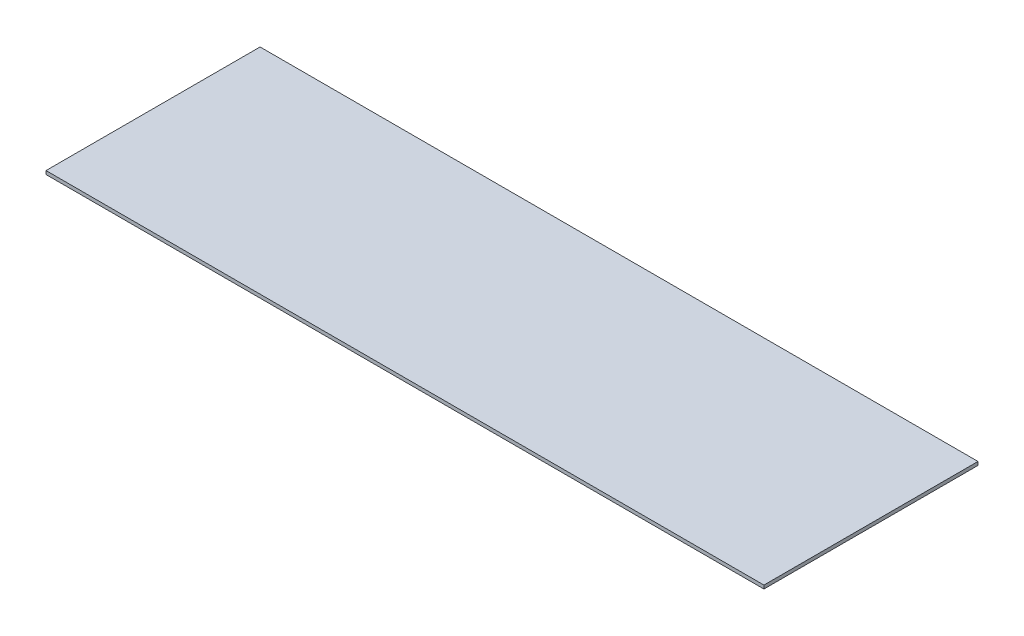
ISO-10303-21;
HEADER;
FILE_DESCRIPTION(('STEP AP214'),'2;1');
FILE_NAME('part.step','',(''),(''),'','','');
FILE_SCHEMA(('AUTOMOTIVE_DESIGN { 1 0 10303 214 1 1 1 1 }'));
ENDSEC;
DATA;
#1=APPLICATION_CONTEXT('core data for automotive mechanical design processes');
#2=APPLICATION_PROTOCOL_DEFINITION('international standard','automotive_design',2000,#1);
#3=PRODUCT_CONTEXT('',#1,'mechanical');
#4=PRODUCT('Part','Part','',(#3));
#5=PRODUCT_RELATED_PRODUCT_CATEGORY('part','',(#4));
#6=PRODUCT_DEFINITION_FORMATION('','',#4);
#7=PRODUCT_DEFINITION_CONTEXT('part definition',#1,'design');
#8=PRODUCT_DEFINITION('design','',#6,#7);
#9=PRODUCT_DEFINITION_SHAPE('','',#8);
#10=(LENGTH_UNIT() NAMED_UNIT(*) SI_UNIT(.MILLI.,.METRE.));
#11=(NAMED_UNIT(*) PLANE_ANGLE_UNIT() SI_UNIT($,.RADIAN.));
#12=(NAMED_UNIT(*) SI_UNIT($,.STERADIAN.) SOLID_ANGLE_UNIT());
#13=UNCERTAINTY_MEASURE_WITH_UNIT(LENGTH_MEASURE(1.E-05),#10,'distance_accuracy_value','');
#14=(GEOMETRIC_REPRESENTATION_CONTEXT(3) GLOBAL_UNCERTAINTY_ASSIGNED_CONTEXT((#13)) GLOBAL_UNIT_ASSIGNED_CONTEXT((#10,
#11,#12)) REPRESENTATION_CONTEXT('',''));
#15=CARTESIAN_POINT('',(0.,0.,0.));
#16=DIRECTION('',(0.,0.,1.));
#17=DIRECTION('',(1.,0.,0.));
#18=AXIS2_PLACEMENT_3D('',#15,#16,#17);
#19=CARTESIAN_POINT('',(-657.606,3.175,0.));
#20=DIRECTION('',(-1.,0.,0.));
#21=DIRECTION('',(0.,0.,1.));
#22=AXIS2_PLACEMENT_3D('',#19,#20,#21);
#23=PLANE('',#22);
#24=DIRECTION('',(0.,0.,-1.));
#25=VECTOR('',#24,1.);
#26=CARTESIAN_POINT('',(-657.606,0.,0.));
#27=LINE('',#26,#25);
#28=CARTESIAN_POINT('',(-657.606,0.,0.));
#29=VERTEX_POINT('',#28);
#30=CARTESIAN_POINT('',(-657.606,0.,-196.088));
#31=VERTEX_POINT('',#30);
#32=EDGE_CURVE('E110',#29,#31,#27,.T.);
#33=ORIENTED_EDGE('',*,*,#32,.F.);
#34=DIRECTION('',(0.,-1.,0.));
#35=VECTOR('',#34,1.);
#36=CARTESIAN_POINT('',(-657.606,3.175,0.));
#37=LINE('',#36,#35);
#38=CARTESIAN_POINT('',(-657.606,3.175,0.));
#39=VERTEX_POINT('',#38);
#40=EDGE_CURVE('E11',#39,#29,#37,.T.);
#41=ORIENTED_EDGE('',*,*,#40,.F.);
#42=DIRECTION('',(0.,0.,-1.));
#43=VECTOR('',#42,1.);
#44=CARTESIAN_POINT('',(-657.606,3.175,0.));
#45=LINE('',#44,#43);
#46=CARTESIAN_POINT('',(-657.606,3.175,-196.088));
#47=VERTEX_POINT('',#46);
#48=EDGE_CURVE('E101',#39,#47,#45,.T.);
#49=ORIENTED_EDGE('',*,*,#48,.T.);
#50=DIRECTION('',(0.,-1.,0.));
#51=VECTOR('',#50,1.);
#52=CARTESIAN_POINT('',(-657.606,3.175,-196.088));
#53=LINE('',#52,#51);
#54=EDGE_CURVE('E80',#47,#31,#53,.T.);
#55=ORIENTED_EDGE('',*,*,#54,.T.);
#56=EDGE_LOOP('',(#33,#41,#49,#55));
#57=FACE_BOUND('',#56,.T.);
#58=ADVANCED_FACE('F41',(#57),#23,.T.);
#59=CARTESIAN_POINT('',(0.,3.175,0.));
#60=DIRECTION('',(0.,0.,1.));
#61=DIRECTION('',(1.,0.,0.));
#62=AXIS2_PLACEMENT_3D('',#59,#60,#61);
#63=PLANE('',#62);
#64=DIRECTION('',(-1.,0.,0.));
#65=VECTOR('',#64,1.);
#66=CARTESIAN_POINT('',(0.,0.,0.));
#67=LINE('',#66,#65);
#68=CARTESIAN_POINT('',(0.,0.,0.));
#69=VERTEX_POINT('',#68);
#70=EDGE_CURVE('E93',#69,#29,#67,.T.);
#71=ORIENTED_EDGE('',*,*,#70,.F.);
#72=DIRECTION('',(0.,-1.,0.));
#73=VECTOR('',#72,1.);
#74=CARTESIAN_POINT('',(0.,3.175,0.));
#75=LINE('',#74,#73);
#76=CARTESIAN_POINT('',(0.,3.175,0.));
#77=VERTEX_POINT('',#76);
#78=EDGE_CURVE('E50',#77,#69,#75,.T.);
#79=ORIENTED_EDGE('',*,*,#78,.F.);
#80=DIRECTION('',(-1.,0.,0.));
#81=VECTOR('',#80,1.);
#82=CARTESIAN_POINT('',(0.,3.175,0.));
#83=LINE('',#82,#81);
#84=EDGE_CURVE('E91',#77,#39,#83,.T.);
#85=ORIENTED_EDGE('',*,*,#84,.T.);
#86=ORIENTED_EDGE('',*,*,#40,.T.);
#87=EDGE_LOOP('',(#71,#79,#85,#86));
#88=FACE_BOUND('',#87,.T.);
#89=ADVANCED_FACE('F89',(#88),#63,.T.);
#90=CARTESIAN_POINT('',(0.,3.175,0.));
#91=DIRECTION('',(-1.,0.,0.));
#92=DIRECTION('',(0.,0.,1.));
#93=AXIS2_PLACEMENT_3D('',#90,#91,#92);
#94=PLANE('',#93);
#95=DIRECTION('',(0.,0.,-1.));
#96=VECTOR('',#95,1.);
#97=CARTESIAN_POINT('',(0.,0.,0.));
#98=LINE('',#97,#96);
#99=CARTESIAN_POINT('',(0.,0.,-196.088));
#100=VERTEX_POINT('',#99);
#101=EDGE_CURVE('E73',#69,#100,#98,.T.);
#102=ORIENTED_EDGE('',*,*,#101,.T.);
#103=DIRECTION('',(0.,-1.,0.));
#104=VECTOR('',#103,1.);
#105=CARTESIAN_POINT('',(0.,3.175,-196.088));
#106=LINE('',#105,#104);
#107=CARTESIAN_POINT('',(0.,3.175,-196.088));
#108=VERTEX_POINT('',#107);
#109=EDGE_CURVE('E95',#108,#100,#106,.T.);
#110=ORIENTED_EDGE('',*,*,#109,.F.);
#111=DIRECTION('',(0.,0.,-1.));
#112=VECTOR('',#111,1.);
#113=CARTESIAN_POINT('',(0.,3.175,0.));
#114=LINE('',#113,#112);
#115=EDGE_CURVE('E96',#77,#108,#114,.T.);
#116=ORIENTED_EDGE('',*,*,#115,.F.);
#117=ORIENTED_EDGE('',*,*,#78,.T.);
#118=EDGE_LOOP('',(#102,#110,#116,#117));
#119=FACE_BOUND('',#118,.T.);
#120=ADVANCED_FACE('F97',(#119),#94,.F.);
#121=CARTESIAN_POINT('',(0.,3.175,-196.088));
#122=DIRECTION('',(0.,0.,1.));
#123=DIRECTION('',(1.,0.,0.));
#124=AXIS2_PLACEMENT_3D('',#121,#122,#123);
#125=PLANE('',#124);
#126=DIRECTION('',(-1.,0.,0.));
#127=VECTOR('',#126,1.);
#128=CARTESIAN_POINT('',(0.,0.,-196.088));
#129=LINE('',#128,#127);
#130=EDGE_CURVE('E105',#100,#31,#129,.T.);
#131=ORIENTED_EDGE('',*,*,#130,.T.);
#132=ORIENTED_EDGE('',*,*,#54,.F.);
#133=DIRECTION('',(-1.,0.,0.));
#134=VECTOR('',#133,1.);
#135=CARTESIAN_POINT('',(0.,3.175,-196.088));
#136=LINE('',#135,#134);
#137=EDGE_CURVE('E58',#108,#47,#136,.T.);
#138=ORIENTED_EDGE('',*,*,#137,.F.);
#139=ORIENTED_EDGE('',*,*,#109,.T.);
#140=EDGE_LOOP('',(#131,#132,#138,#139));
#141=FACE_BOUND('',#140,.T.);
#142=ADVANCED_FACE('F125',(#141),#125,.F.);
#143=CARTESIAN_POINT('',(0.,3.175,0.));
#144=DIRECTION('',(0.,1.,0.));
#145=DIRECTION('',(0.,0.,1.));
#146=AXIS2_PLACEMENT_3D('',#143,#144,#145);
#147=PLANE('',#146);
#148=ORIENTED_EDGE('',*,*,#48,.F.);
#149=ORIENTED_EDGE('',*,*,#84,.F.);
#150=ORIENTED_EDGE('',*,*,#115,.T.);
#151=ORIENTED_EDGE('',*,*,#137,.T.);
#152=EDGE_LOOP('',(#148,#149,#150,#151));
#153=FACE_BOUND('',#152,.T.);
#154=ADVANCED_FACE('F100',(#153),#147,.T.);
#155=CARTESIAN_POINT('',(0.,0.,0.));
#156=DIRECTION('',(0.,1.,0.));
#157=DIRECTION('',(0.,0.,1.));
#158=AXIS2_PLACEMENT_3D('',#155,#156,#157);
#159=PLANE('',#158);
#160=ORIENTED_EDGE('',*,*,#32,.T.);
#161=ORIENTED_EDGE('',*,*,#130,.F.);
#162=ORIENTED_EDGE('',*,*,#101,.F.);
#163=ORIENTED_EDGE('',*,*,#70,.T.);
#164=EDGE_LOOP('',(#160,#161,#162,#163));
#165=FACE_BOUND('',#164,.T.);
#166=ADVANCED_FACE('F127',(#165),#159,.F.);
#167=CLOSED_SHELL('',(#58,#89,#120,#142,#154,#166));
#168=MANIFOLD_SOLID_BREP('B2',#167);
#169=ADVANCED_BREP_SHAPE_REPRESENTATION('',(#18,#168),#14);
#170=SHAPE_DEFINITION_REPRESENTATION(#9,#169);
ENDSEC;
END-ISO-10303-21;
